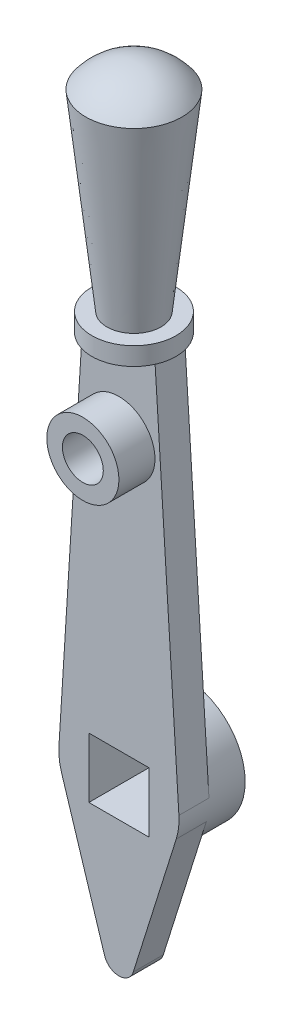
ISO-10303-21;
HEADER;
FILE_DESCRIPTION(('STEP AP214'),'2;1');
FILE_NAME('part.step','',(''),(''),'','','');
FILE_SCHEMA(('AUTOMOTIVE_DESIGN { 1 0 10303 214 1 1 1 1 }'));
ENDSEC;
DATA;
#1=APPLICATION_CONTEXT('core data for automotive mechanical design processes');
#2=APPLICATION_PROTOCOL_DEFINITION('international standard','automotive_design',2000,#1);
#3=PRODUCT_CONTEXT('',#1,'mechanical');
#4=PRODUCT('Part','Part','',(#3));
#5=PRODUCT_RELATED_PRODUCT_CATEGORY('part','',(#4));
#6=PRODUCT_DEFINITION_FORMATION('','',#4);
#7=PRODUCT_DEFINITION_CONTEXT('part definition',#1,'design');
#8=PRODUCT_DEFINITION('design','',#6,#7);
#9=PRODUCT_DEFINITION_SHAPE('','',#8);
#10=(LENGTH_UNIT() NAMED_UNIT(*) SI_UNIT(.MILLI.,.METRE.));
#11=(NAMED_UNIT(*) PLANE_ANGLE_UNIT() SI_UNIT($,.RADIAN.));
#12=(NAMED_UNIT(*) SI_UNIT($,.STERADIAN.) SOLID_ANGLE_UNIT());
#13=UNCERTAINTY_MEASURE_WITH_UNIT(LENGTH_MEASURE(1.E-05),#10,'distance_accuracy_value','');
#14=(GEOMETRIC_REPRESENTATION_CONTEXT(3) GLOBAL_UNCERTAINTY_ASSIGNED_CONTEXT((#13)) GLOBAL_UNIT_ASSIGNED_CONTEXT((#10,
#11,#12)) REPRESENTATION_CONTEXT('',''));
#15=CARTESIAN_POINT('',(0.,0.,0.));
#16=DIRECTION('',(0.,0.,1.));
#17=DIRECTION('',(1.,0.,0.));
#18=AXIS2_PLACEMENT_3D('',#15,#16,#17);
#19=CARTESIAN_POINT('',(0.,0.,-2.5));
#20=DIRECTION('',(0.,0.,1.));
#21=DIRECTION('',(1.,0.,0.));
#22=AXIS2_PLACEMENT_3D('',#19,#20,#21);
#23=PLANE('',#22);
#24=CARTESIAN_POINT('',(0.,50.,-2.5));
#25=DIRECTION('',(0.,0.,1.));
#26=DIRECTION('',(1.,0.,0.));
#27=AXIS2_PLACEMENT_3D('',#24,#25,#26);
#28=CIRCLE('',#27,3.39999999999999);
#29=CARTESIAN_POINT('',(3.39999999999999,50.,-2.5));
#30=VERTEX_POINT('',#29);
#31=EDGE_CURVE('E232',#30,#30,#28,.T.);
#32=ORIENTED_EDGE('',*,*,#31,.T.);
#33=EDGE_LOOP('',(#32));
#34=FACE_BOUND('',#33,.T.);
#35=DIRECTION('',(-0.0626843686366648,0.998033401208909,0.));
#36=VECTOR('',#35,1.);
#37=CARTESIAN_POINT('',(6.,64.,-2.5));
#38=LINE('',#37,#36);
#39=CARTESIAN_POINT('',(9.98033401208909,0.626843686366649,-2.5));
#40=VERTEX_POINT('',#39);
#41=CARTESIAN_POINT('',(6.,64.,-2.5));
#42=VERTEX_POINT('',#41);
#43=EDGE_CURVE('E140',#40,#42,#38,.T.);
#44=ORIENTED_EDGE('',*,*,#43,.F.);
#45=CARTESIAN_POINT('',(0.,0.,-2.5));
#46=DIRECTION('',(0.,0.,1.));
#47=DIRECTION('',(1.,0.,0.));
#48=AXIS2_PLACEMENT_3D('',#45,#46,#47);
#49=CIRCLE('',#48,10.);
#50=CARTESIAN_POINT('',(-9.98033401208909,0.626843686366649,-2.5));
#51=VERTEX_POINT('',#50);
#52=EDGE_CURVE('E11',#40,#51,#49,.T.);
#53=ORIENTED_EDGE('',*,*,#52,.T.);
#54=DIRECTION('',(-0.0626843686366648,-0.998033401208909,0.));
#55=VECTOR('',#54,1.);
#56=CARTESIAN_POINT('',(-6.,64.,-2.5));
#57=LINE('',#56,#55);
#58=CARTESIAN_POINT('',(-6.,64.,-2.5));
#59=VERTEX_POINT('',#58);
#60=EDGE_CURVE('E143',#59,#51,#57,.T.);
#61=ORIENTED_EDGE('',*,*,#60,.F.);
#62=DIRECTION('',(-1.,0.,0.));
#63=VECTOR('',#62,1.);
#64=CARTESIAN_POINT('',(6.,64.,-2.5));
#65=LINE('',#64,#63);
#66=EDGE_CURVE('E138',#42,#59,#65,.T.);
#67=ORIENTED_EDGE('',*,*,#66,.F.);
#68=EDGE_LOOP('',(#44,#53,#61,#67));
#69=FACE_BOUND('',#68,.T.);
#70=ADVANCED_FACE('F47',(#34,#69),#23,.F.);
#71=CARTESIAN_POINT('',(6.,64.,2.5));
#72=DIRECTION('',(-0.998033401208909,-0.0626843686366648,0.));
#73=DIRECTION('',(0.0626843686366648,-0.998033401208909,0.));
#74=AXIS2_PLACEMENT_3D('',#71,#72,#73);
#75=PLANE('',#74);
#76=ORIENTED_EDGE('',*,*,#43,.T.);
#77=DIRECTION('',(0.,0.,-1.));
#78=VECTOR('',#77,1.);
#79=CARTESIAN_POINT('',(6.,64.,2.5));
#80=LINE('',#79,#78);
#81=CARTESIAN_POINT('',(6.,64.,2.5));
#82=VERTEX_POINT('',#81);
#83=EDGE_CURVE('E151',#82,#42,#80,.T.);
#84=ORIENTED_EDGE('',*,*,#83,.F.);
#85=DIRECTION('',(-0.0626843686366648,0.998033401208909,0.));
#86=VECTOR('',#85,1.);
#87=CARTESIAN_POINT('',(6.,64.,2.5));
#88=LINE('',#87,#86);
#89=CARTESIAN_POINT('',(9.98033401208909,0.626843686366649,2.5));
#90=VERTEX_POINT('',#89);
#91=EDGE_CURVE('E219',#90,#82,#88,.T.);
#92=ORIENTED_EDGE('',*,*,#91,.F.);
#93=DIRECTION('',(0.,0.,-1.));
#94=VECTOR('',#93,1.);
#95=CARTESIAN_POINT('',(9.98033401208909,0.626843686366649,2.5));
#96=LINE('',#95,#94);
#97=EDGE_CURVE('E154',#90,#40,#96,.T.);
#98=ORIENTED_EDGE('',*,*,#97,.T.);
#99=EDGE_LOOP('',(#76,#84,#92,#98));
#100=FACE_BOUND('',#99,.T.);
#101=ADVANCED_FACE('F49',(#100),#75,.F.);
#102=CARTESIAN_POINT('',(-6.,64.,2.5));
#103=DIRECTION('',(0.998033401208909,-0.0626843686366648,0.));
#104=DIRECTION('',(0.0626843686366648,0.998033401208909,0.));
#105=AXIS2_PLACEMENT_3D('',#102,#103,#104);
#106=PLANE('',#105);
#107=ORIENTED_EDGE('',*,*,#60,.T.);
#108=DIRECTION('',(0.,0.,-1.));
#109=VECTOR('',#108,1.);
#110=CARTESIAN_POINT('',(-9.98033401208909,0.626843686366649,2.5));
#111=LINE('',#110,#109);
#112=CARTESIAN_POINT('',(-9.98033401208909,0.626843686366649,2.5));
#113=VERTEX_POINT('',#112);
#114=EDGE_CURVE('E167',#113,#51,#111,.T.);
#115=ORIENTED_EDGE('',*,*,#114,.F.);
#116=DIRECTION('',(-0.0626843686366648,-0.998033401208909,0.));
#117=VECTOR('',#116,1.);
#118=CARTESIAN_POINT('',(-6.,64.,2.5));
#119=LINE('',#118,#117);
#120=CARTESIAN_POINT('',(-6.,64.,2.5));
#121=VERTEX_POINT('',#120);
#122=EDGE_CURVE('E214',#121,#113,#119,.T.);
#123=ORIENTED_EDGE('',*,*,#122,.F.);
#124=DIRECTION('',(0.,0.,-1.));
#125=VECTOR('',#124,1.);
#126=CARTESIAN_POINT('',(-6.,64.,2.5));
#127=LINE('',#126,#125);
#128=EDGE_CURVE('E161',#121,#59,#127,.T.);
#129=ORIENTED_EDGE('',*,*,#128,.T.);
#130=EDGE_LOOP('',(#107,#115,#123,#129));
#131=FACE_BOUND('',#130,.T.);
#132=ADVANCED_FACE('F316',(#131),#106,.F.);
#133=CARTESIAN_POINT('',(0.,0.,2.5));
#134=DIRECTION('',(0.,0.,-1.));
#135=DIRECTION('',(-1.,0.,0.));
#136=AXIS2_PLACEMENT_3D('',#133,#134,#135);
#137=CYLINDRICAL_SURFACE('',#136,10.);
#138=ORIENTED_EDGE('',*,*,#114,.T.);
#139=ORIENTED_EDGE('',*,*,#52,.F.);
#140=ORIENTED_EDGE('',*,*,#97,.F.);
#141=CARTESIAN_POINT('',(0.,0.,2.5));
#142=DIRECTION('',(0.,0.,1.));
#143=DIRECTION('',(1.,0.,0.));
#144=AXIS2_PLACEMENT_3D('',#141,#142,#143);
#145=CIRCLE('',#144,10.);
#146=CARTESIAN_POINT('',(9.53939201416945,-3.,2.5));
#147=VERTEX_POINT('',#146);
#148=EDGE_CURVE('E194',#147,#90,#145,.T.);
#149=ORIENTED_EDGE('',*,*,#148,.F.);
#150=DIRECTION('',(0.,0.,-1.));
#151=VECTOR('',#150,1.);
#152=CARTESIAN_POINT('',(9.53939201416945,-3.,2.5));
#153=LINE('',#152,#151);
#154=CARTESIAN_POINT('',(9.53939201416946,-3.,-2.5));
#155=VERTEX_POINT('',#154);
#156=EDGE_CURVE('E185',#147,#155,#153,.T.);
#157=ORIENTED_EDGE('',*,*,#156,.T.);
#158=CARTESIAN_POINT('',(-9.53939201416946,-3.,-2.5));
#159=VERTEX_POINT('',#158);
#160=EDGE_CURVE('E51',#159,#155,#49,.T.);
#161=ORIENTED_EDGE('',*,*,#160,.F.);
#162=DIRECTION('',(0.,0.,-1.));
#163=VECTOR('',#162,1.);
#164=CARTESIAN_POINT('',(-9.53939201416946,-3.,2.5));
#165=LINE('',#164,#163);
#166=CARTESIAN_POINT('',(-9.53939201416946,-3.,2.5));
#167=VERTEX_POINT('',#166);
#168=EDGE_CURVE('E173',#167,#159,#165,.T.);
#169=ORIENTED_EDGE('',*,*,#168,.F.);
#170=CARTESIAN_POINT('',(0.,0.,2.5));
#171=DIRECTION('',(0.,0.,1.));
#172=DIRECTION('',(1.,0.,0.));
#173=AXIS2_PLACEMENT_3D('',#170,#171,#172);
#174=CIRCLE('',#173,10.);
#175=EDGE_CURVE('E211',#113,#167,#174,.T.);
#176=ORIENTED_EDGE('',*,*,#175,.F.);
#177=EDGE_LOOP('',(#138,#139,#140,#149,#157,#161,#169,#176));
#178=FACE_BOUND('',#177,.T.);
#179=CARTESIAN_POINT('',(0.,0.,-8.5));
#180=DIRECTION('',(0.,0.,1.));
#181=DIRECTION('',(1.,0.,0.));
#182=AXIS2_PLACEMENT_3D('',#179,#180,#181);
#183=CIRCLE('',#182,10.);
#184=CARTESIAN_POINT('',(10.,0.,-8.5));
#185=VERTEX_POINT('',#184);
#186=EDGE_CURVE('E156',#185,#185,#183,.T.);
#187=ORIENTED_EDGE('',*,*,#186,.T.);
#188=EDGE_LOOP('',(#187));
#189=FACE_BOUND('',#188,.T.);
#190=ADVANCED_FACE('F353',(#178,#189),#137,.T.);
#191=CARTESIAN_POINT('',(-9.53939201416945,-3.,2.5));
#192=DIRECTION('',(0.953939201416946,0.3,0.));
#193=DIRECTION('',(-0.3,0.953939201416946,0.));
#194=AXIS2_PLACEMENT_3D('',#191,#192,#193);
#195=PLANE('',#194);
#196=DIRECTION('',(0.3,-0.953939201416946,0.));
#197=VECTOR('',#196,1.);
#198=CARTESIAN_POINT('',(-9.53939201416945,-3.,-2.5));
#199=LINE('',#198,#197);
#200=CARTESIAN_POINT('',(-2.38484800354236,-25.75,-2.5));
#201=VERTEX_POINT('',#200);
#202=EDGE_CURVE('E198',#159,#201,#199,.T.);
#203=ORIENTED_EDGE('',*,*,#202,.T.);
#204=DIRECTION('',(0.,0.,-1.));
#205=VECTOR('',#204,1.);
#206=CARTESIAN_POINT('',(-2.38484800354236,-25.75,2.5));
#207=LINE('',#206,#205);
#208=CARTESIAN_POINT('',(-2.38484800354236,-25.75,2.5));
#209=VERTEX_POINT('',#208);
#210=EDGE_CURVE('E177',#209,#201,#207,.T.);
#211=ORIENTED_EDGE('',*,*,#210,.F.);
#212=DIRECTION('',(0.3,-0.953939201416946,0.));
#213=VECTOR('',#212,1.);
#214=CARTESIAN_POINT('',(-9.53939201416945,-3.,2.5));
#215=LINE('',#214,#213);
#216=EDGE_CURVE('E208',#167,#209,#215,.T.);
#217=ORIENTED_EDGE('',*,*,#216,.F.);
#218=ORIENTED_EDGE('',*,*,#168,.T.);
#219=EDGE_LOOP('',(#203,#211,#217,#218));
#220=FACE_BOUND('',#219,.T.);
#221=ADVANCED_FACE('F339',(#220),#195,.F.);
#222=CARTESIAN_POINT('',(0.,-25.,2.5));
#223=DIRECTION('',(0.,0.,-1.));
#224=DIRECTION('',(-1.,0.,0.));
#225=AXIS2_PLACEMENT_3D('',#222,#223,#224);
#226=CYLINDRICAL_SURFACE('',#225,2.5);
#227=CARTESIAN_POINT('',(0.,-25.,-2.5));
#228=DIRECTION('',(0.,0.,1.));
#229=DIRECTION('',(1.,0.,0.));
#230=AXIS2_PLACEMENT_3D('',#227,#228,#229);
#231=CIRCLE('',#230,2.5);
#232=CARTESIAN_POINT('',(2.38484800354236,-25.75,-2.5));
#233=VERTEX_POINT('',#232);
#234=EDGE_CURVE('E195',#201,#233,#231,.T.);
#235=ORIENTED_EDGE('',*,*,#234,.T.);
#236=DIRECTION('',(0.,0.,-1.));
#237=VECTOR('',#236,1.);
#238=CARTESIAN_POINT('',(2.38484800354236,-25.75,2.5));
#239=LINE('',#238,#237);
#240=CARTESIAN_POINT('',(2.38484800354236,-25.75,2.5));
#241=VERTEX_POINT('',#240);
#242=EDGE_CURVE('E181',#241,#233,#239,.T.);
#243=ORIENTED_EDGE('',*,*,#242,.F.);
#244=CARTESIAN_POINT('',(0.,-25.,2.5));
#245=DIRECTION('',(0.,0.,1.));
#246=DIRECTION('',(1.,0.,0.));
#247=AXIS2_PLACEMENT_3D('',#244,#245,#246);
#248=CIRCLE('',#247,2.5);
#249=EDGE_CURVE('E205',#209,#241,#248,.T.);
#250=ORIENTED_EDGE('',*,*,#249,.F.);
#251=ORIENTED_EDGE('',*,*,#210,.T.);
#252=EDGE_LOOP('',(#235,#243,#250,#251));
#253=FACE_BOUND('',#252,.T.);
#254=ADVANCED_FACE('F344',(#253),#226,.T.);
#255=CARTESIAN_POINT('',(9.53939201416945,-3.,2.5));
#256=DIRECTION('',(-0.953939201416946,0.3,0.));
#257=DIRECTION('',(-0.3,-0.953939201416946,0.));
#258=AXIS2_PLACEMENT_3D('',#255,#256,#257);
#259=PLANE('',#258);
#260=DIRECTION('',(0.3,0.953939201416946,0.));
#261=VECTOR('',#260,1.);
#262=CARTESIAN_POINT('',(9.53939201416945,-3.,-2.5));
#263=LINE('',#262,#261);
#264=EDGE_CURVE('E190',#233,#155,#263,.T.);
#265=ORIENTED_EDGE('',*,*,#264,.T.);
#266=ORIENTED_EDGE('',*,*,#156,.F.);
#267=DIRECTION('',(0.3,0.953939201416946,0.));
#268=VECTOR('',#267,1.);
#269=CARTESIAN_POINT('',(9.53939201416945,-3.,2.5));
#270=LINE('',#269,#268);
#271=EDGE_CURVE('E189',#241,#147,#270,.T.);
#272=ORIENTED_EDGE('',*,*,#271,.F.);
#273=ORIENTED_EDGE('',*,*,#242,.T.);
#274=EDGE_LOOP('',(#265,#266,#272,#273));
#275=FACE_BOUND('',#274,.T.);
#276=ADVANCED_FACE('F332',(#275),#259,.F.);
#277=CARTESIAN_POINT('',(0.,0.,2.5));
#278=DIRECTION('',(0.,0.,1.));
#279=DIRECTION('',(1.,0.,0.));
#280=AXIS2_PLACEMENT_3D('',#277,#278,#279);
#281=PLANE('',#280);
#282=DIRECTION('',(0.,1.,0.));
#283=VECTOR('',#282,1.);
#284=CARTESIAN_POINT('',(5.,0.,2.5));
#285=LINE('',#284,#283);
#286=CARTESIAN_POINT('',(5.,-5.,2.5));
#287=VERTEX_POINT('',#286);
#288=CARTESIAN_POINT('',(5.,5.,2.5));
#289=VERTEX_POINT('',#288);
#290=EDGE_CURVE('E243',#287,#289,#285,.T.);
#291=ORIENTED_EDGE('',*,*,#290,.F.);
#292=DIRECTION('',(1.,0.,0.));
#293=VECTOR('',#292,1.);
#294=CARTESIAN_POINT('',(0.,-5.,2.5));
#295=LINE('',#294,#293);
#296=CARTESIAN_POINT('',(-5.,-5.,2.5));
#297=VERTEX_POINT('',#296);
#298=EDGE_CURVE('E252',#297,#287,#295,.T.);
#299=ORIENTED_EDGE('',*,*,#298,.F.);
#300=DIRECTION('',(0.,-1.,0.));
#301=VECTOR('',#300,1.);
#302=CARTESIAN_POINT('',(-5.,0.,2.5));
#303=LINE('',#302,#301);
#304=CARTESIAN_POINT('',(-5.,5.,2.5));
#305=VERTEX_POINT('',#304);
#306=EDGE_CURVE('E249',#305,#297,#303,.T.);
#307=ORIENTED_EDGE('',*,*,#306,.F.);
#308=DIRECTION('',(-1.,0.,0.));
#309=VECTOR('',#308,1.);
#310=CARTESIAN_POINT('',(0.,5.,2.5));
#311=LINE('',#310,#309);
#312=EDGE_CURVE('E246',#289,#305,#311,.T.);
#313=ORIENTED_EDGE('',*,*,#312,.F.);
#314=EDGE_LOOP('',(#291,#299,#307,#313));
#315=FACE_BOUND('',#314,.T.);
#316=CARTESIAN_POINT('',(0.,50.,2.5));
#317=DIRECTION('',(0.,0.,1.));
#318=DIRECTION('',(1.,0.,0.));
#319=AXIS2_PLACEMENT_3D('',#316,#317,#318);
#320=CIRCLE('',#319,6.);
#321=CARTESIAN_POINT('',(6.,50.,2.5));
#322=VERTEX_POINT('',#321);
#323=EDGE_CURVE('E228',#322,#322,#320,.T.);
#324=ORIENTED_EDGE('',*,*,#323,.F.);
#325=EDGE_LOOP('',(#324));
#326=FACE_BOUND('',#325,.T.);
#327=ORIENTED_EDGE('',*,*,#271,.T.);
#328=ORIENTED_EDGE('',*,*,#148,.T.);
#329=ORIENTED_EDGE('',*,*,#91,.T.);
#330=DIRECTION('',(-1.,0.,0.));
#331=VECTOR('',#330,1.);
#332=CARTESIAN_POINT('',(6.,64.,2.5));
#333=LINE('',#332,#331);
#334=EDGE_CURVE('E159',#82,#121,#333,.T.);
#335=ORIENTED_EDGE('',*,*,#334,.T.);
#336=ORIENTED_EDGE('',*,*,#122,.T.);
#337=ORIENTED_EDGE('',*,*,#175,.T.);
#338=ORIENTED_EDGE('',*,*,#216,.T.);
#339=ORIENTED_EDGE('',*,*,#249,.T.);
#340=EDGE_LOOP('',(#327,#328,#329,#335,#336,#337,#338,#339));
#341=FACE_BOUND('',#340,.T.);
#342=ADVANCED_FACE('F321',(#315,#326,#341),#281,.T.);
#343=ORIENTED_EDGE('',*,*,#202,.F.);
#344=ORIENTED_EDGE('',*,*,#160,.T.);
#345=ORIENTED_EDGE('',*,*,#264,.F.);
#346=ORIENTED_EDGE('',*,*,#234,.F.);
#347=EDGE_LOOP('',(#343,#344,#345,#346));
#348=FACE_BOUND('',#347,.T.);
#349=ADVANCED_FACE('F311',(#348),#23,.F.);
#350=CARTESIAN_POINT('',(0.,0.,-8.5));
#351=DIRECTION('',(0.,0.,1.));
#352=DIRECTION('',(1.,0.,0.));
#353=AXIS2_PLACEMENT_3D('',#350,#351,#352);
#354=PLANE('',#353);
#355=DIRECTION('',(-1.,0.,0.));
#356=VECTOR('',#355,1.);
#357=CARTESIAN_POINT('',(-5.,-5.,-8.5));
#358=LINE('',#357,#356);
#359=CARTESIAN_POINT('',(5.,-5.,-8.5));
#360=VERTEX_POINT('',#359);
#361=CARTESIAN_POINT('',(-5.,-5.,-8.5));
#362=VERTEX_POINT('',#361);
#363=EDGE_CURVE('E274',#360,#362,#358,.T.);
#364=ORIENTED_EDGE('',*,*,#363,.F.);
#365=DIRECTION('',(0.,-1.,0.));
#366=VECTOR('',#365,1.);
#367=CARTESIAN_POINT('',(5.,5.,-8.5));
#368=LINE('',#367,#366);
#369=CARTESIAN_POINT('',(5.,5.,-8.5));
#370=VERTEX_POINT('',#369);
#371=EDGE_CURVE('E71',#370,#360,#368,.T.);
#372=ORIENTED_EDGE('',*,*,#371,.F.);
#373=DIRECTION('',(1.,0.,0.));
#374=VECTOR('',#373,1.);
#375=CARTESIAN_POINT('',(-5.,5.,-8.5));
#376=LINE('',#375,#374);
#377=CARTESIAN_POINT('',(-5.,5.,-8.5));
#378=VERTEX_POINT('',#377);
#379=EDGE_CURVE('E259',#378,#370,#376,.T.);
#380=ORIENTED_EDGE('',*,*,#379,.F.);
#381=DIRECTION('',(0.,1.,0.));
#382=VECTOR('',#381,1.);
#383=CARTESIAN_POINT('',(-5.,5.,-8.5));
#384=LINE('',#383,#382);
#385=EDGE_CURVE('E270',#362,#378,#384,.T.);
#386=ORIENTED_EDGE('',*,*,#385,.F.);
#387=EDGE_LOOP('',(#364,#372,#380,#386));
#388=FACE_BOUND('',#387,.T.);
#389=ORIENTED_EDGE('',*,*,#186,.F.);
#390=EDGE_LOOP('',(#389));
#391=FACE_BOUND('',#390,.T.);
#392=ADVANCED_FACE('F320',(#388,#391),#354,.F.);
#393=CARTESIAN_POINT('',(0.,50.,8.5));
#394=DIRECTION('',(0.,0.,-1.));
#395=DIRECTION('',(-1.,0.,0.));
#396=AXIS2_PLACEMENT_3D('',#393,#394,#395);
#397=CYLINDRICAL_SURFACE('',#396,6.);
#398=CARTESIAN_POINT('',(0.,50.,8.5));
#399=DIRECTION('',(0.,0.,1.));
#400=DIRECTION('',(1.,0.,0.));
#401=AXIS2_PLACEMENT_3D('',#398,#399,#400);
#402=CIRCLE('',#401,6.);
#403=CARTESIAN_POINT('',(6.,50.,8.5));
#404=VERTEX_POINT('',#403);
#405=EDGE_CURVE('E227',#404,#404,#402,.T.);
#406=ORIENTED_EDGE('',*,*,#405,.F.);
#407=EDGE_LOOP('',(#406));
#408=FACE_BOUND('',#407,.T.);
#409=ORIENTED_EDGE('',*,*,#323,.T.);
#410=EDGE_LOOP('',(#409));
#411=FACE_BOUND('',#410,.T.);
#412=ADVANCED_FACE('F328',(#408,#411),#397,.T.);
#413=CARTESIAN_POINT('',(0.,50.,8.5));
#414=DIRECTION('',(0.,0.,1.));
#415=DIRECTION('',(1.,0.,0.));
#416=AXIS2_PLACEMENT_3D('',#413,#414,#415);
#417=PLANE('',#416);
#418=CARTESIAN_POINT('',(0.,50.,8.5));
#419=DIRECTION('',(0.,0.,1.));
#420=DIRECTION('',(1.,0.,0.));
#421=AXIS2_PLACEMENT_3D('',#418,#419,#420);
#422=CIRCLE('',#421,3.39999999999999);
#423=CARTESIAN_POINT('',(3.39999999999999,50.,8.5));
#424=VERTEX_POINT('',#423);
#425=EDGE_CURVE('E239',#424,#424,#422,.T.);
#426=ORIENTED_EDGE('',*,*,#425,.F.);
#427=EDGE_LOOP('',(#426));
#428=FACE_BOUND('',#427,.T.);
#429=ORIENTED_EDGE('',*,*,#405,.T.);
#430=EDGE_LOOP('',(#429));
#431=FACE_BOUND('',#430,.T.);
#432=ADVANCED_FACE('F497',(#428,#431),#417,.T.);
#433=CARTESIAN_POINT('',(0.,50.,8.5));
#434=DIRECTION('',(0.,0.,1.));
#435=DIRECTION('',(1.,0.,0.));
#436=AXIS2_PLACEMENT_3D('',#433,#434,#435);
#437=CYLINDRICAL_SURFACE('',#436,3.39999999999999);
#438=ORIENTED_EDGE('',*,*,#425,.T.);
#439=EDGE_LOOP('',(#438));
#440=FACE_BOUND('',#439,.T.);
#441=ORIENTED_EDGE('',*,*,#31,.F.);
#442=EDGE_LOOP('',(#441));
#443=FACE_BOUND('',#442,.T.);
#444=ADVANCED_FACE('F489',(#440,#443),#437,.F.);
#445=CARTESIAN_POINT('',(5.,5.,8.5));
#446=DIRECTION('',(1.,0.,0.));
#447=DIRECTION('',(0.,1.,0.));
#448=AXIS2_PLACEMENT_3D('',#445,#446,#447);
#449=PLANE('',#448);
#450=ORIENTED_EDGE('',*,*,#290,.T.);
#451=DIRECTION('',(0.,0.,-1.));
#452=VECTOR('',#451,1.);
#453=CARTESIAN_POINT('',(5.,5.,8.5));
#454=LINE('',#453,#452);
#455=EDGE_CURVE('E255',#289,#370,#454,.T.);
#456=ORIENTED_EDGE('',*,*,#455,.T.);
#457=ORIENTED_EDGE('',*,*,#371,.T.);
#458=DIRECTION('',(0.,0.,-1.));
#459=VECTOR('',#458,1.);
#460=CARTESIAN_POINT('',(5.,-5.,8.5));
#461=LINE('',#460,#459);
#462=EDGE_CURVE('E256',#287,#360,#461,.T.);
#463=ORIENTED_EDGE('',*,*,#462,.F.);
#464=EDGE_LOOP('',(#450,#456,#457,#463));
#465=FACE_BOUND('',#464,.T.);
#466=ADVANCED_FACE('F480',(#465),#449,.F.);
#467=CARTESIAN_POINT('',(-5.,5.,8.5));
#468=DIRECTION('',(0.,1.,0.));
#469=DIRECTION('',(-1.,0.,0.));
#470=AXIS2_PLACEMENT_3D('',#467,#468,#469);
#471=PLANE('',#470);
#472=ORIENTED_EDGE('',*,*,#312,.T.);
#473=DIRECTION('',(0.,0.,-1.));
#474=VECTOR('',#473,1.);
#475=CARTESIAN_POINT('',(-5.,5.,8.5));
#476=LINE('',#475,#474);
#477=EDGE_CURVE('E262',#305,#378,#476,.T.);
#478=ORIENTED_EDGE('',*,*,#477,.T.);
#479=ORIENTED_EDGE('',*,*,#379,.T.);
#480=ORIENTED_EDGE('',*,*,#455,.F.);
#481=EDGE_LOOP('',(#472,#478,#479,#480));
#482=FACE_BOUND('',#481,.T.);
#483=ADVANCED_FACE('F471',(#482),#471,.F.);
#484=CARTESIAN_POINT('',(-5.,5.,8.5));
#485=DIRECTION('',(-1.,0.,0.));
#486=DIRECTION('',(0.,-1.,0.));
#487=AXIS2_PLACEMENT_3D('',#484,#485,#486);
#488=PLANE('',#487);
#489=ORIENTED_EDGE('',*,*,#306,.T.);
#490=DIRECTION('',(0.,0.,-1.));
#491=VECTOR('',#490,1.);
#492=CARTESIAN_POINT('',(-5.,-5.,8.5));
#493=LINE('',#492,#491);
#494=EDGE_CURVE('E63',#297,#362,#493,.T.);
#495=ORIENTED_EDGE('',*,*,#494,.T.);
#496=ORIENTED_EDGE('',*,*,#385,.T.);
#497=ORIENTED_EDGE('',*,*,#477,.F.);
#498=EDGE_LOOP('',(#489,#495,#496,#497));
#499=FACE_BOUND('',#498,.T.);
#500=ADVANCED_FACE('F463',(#499),#488,.F.);
#501=CARTESIAN_POINT('',(-5.,-5.,8.5));
#502=DIRECTION('',(0.,-1.,0.));
#503=DIRECTION('',(0.,0.,-1.));
#504=AXIS2_PLACEMENT_3D('',#501,#502,#503);
#505=PLANE('',#504);
#506=ORIENTED_EDGE('',*,*,#298,.T.);
#507=ORIENTED_EDGE('',*,*,#462,.T.);
#508=ORIENTED_EDGE('',*,*,#363,.T.);
#509=ORIENTED_EDGE('',*,*,#494,.F.);
#510=EDGE_LOOP('',(#506,#507,#508,#509));
#511=FACE_BOUND('',#510,.T.);
#512=ADVANCED_FACE('F425',(#511),#505,.F.);
#513=CARTESIAN_POINT('',(0.,64.,0.));
#514=DIRECTION('',(0.,1.,0.));
#515=DIRECTION('',(0.,0.,1.));
#516=AXIS2_PLACEMENT_3D('',#513,#514,#515);
#517=PLANE('',#516);
#518=CARTESIAN_POINT('',(0.,64.,0.));
#519=DIRECTION('',(0.,-1.,0.));
#520=DIRECTION('',(0.,0.,-1.));
#521=AXIS2_PLACEMENT_3D('',#518,#519,#520);
#522=CIRCLE('',#521,7.);
#523=CARTESIAN_POINT('',(0.,64.,-7.));
#524=VERTEX_POINT('',#523);
#525=EDGE_CURVE('E279',#524,#524,#522,.T.);
#526=ORIENTED_EDGE('',*,*,#525,.T.);
#527=EDGE_LOOP('',(#526));
#528=FACE_BOUND('',#527,.T.);
#529=ORIENTED_EDGE('',*,*,#83,.T.);
#530=ORIENTED_EDGE('',*,*,#66,.T.);
#531=ORIENTED_EDGE('',*,*,#128,.F.);
#532=ORIENTED_EDGE('',*,*,#334,.F.);
#533=EDGE_LOOP('',(#529,#530,#531,#532));
#534=FACE_BOUND('',#533,.T.);
#535=ADVANCED_FACE('F158',(#528,#534),#517,.F.);
#536=CARTESIAN_POINT('',(0.,0.,0.));
#537=DIRECTION('',(0.,-1.,0.));
#538=DIRECTION('',(0.,0.,-1.));
#539=AXIS2_PLACEMENT_3D('',#536,#537,#538);
#540=CYLINDRICAL_SURFACE('',#539,7.);
#541=ORIENTED_EDGE('',*,*,#525,.F.);
#542=EDGE_LOOP('',(#541));
#543=FACE_BOUND('',#542,.T.);
#544=CARTESIAN_POINT('',(0.,67.,0.));
#545=DIRECTION('',(0.,-1.,0.));
#546=DIRECTION('',(0.,0.,-1.));
#547=AXIS2_PLACEMENT_3D('',#544,#545,#546);
#548=CIRCLE('',#547,7.);
#549=CARTESIAN_POINT('',(0.,67.,-7.));
#550=VERTEX_POINT('',#549);
#551=EDGE_CURVE('E283',#550,#550,#548,.T.);
#552=ORIENTED_EDGE('',*,*,#551,.T.);
#553=EDGE_LOOP('',(#552));
#554=FACE_BOUND('',#553,.T.);
#555=ADVANCED_FACE('F424',(#543,#554),#540,.T.);
#556=CARTESIAN_POINT('',(-7.,67.,0.));
#557=DIRECTION('',(0.,-1.,0.));
#558=DIRECTION('',(0.,0.,-1.));
#559=AXIS2_PLACEMENT_3D('',#556,#557,#558);
#560=PLANE('',#559);
#561=ORIENTED_EDGE('',*,*,#551,.F.);
#562=EDGE_LOOP('',(#561));
#563=FACE_BOUND('',#562,.T.);
#564=CARTESIAN_POINT('',(0.,67.,0.));
#565=DIRECTION('',(0.,-1.,0.));
#566=DIRECTION('',(0.,0.,-1.));
#567=AXIS2_PLACEMENT_3D('',#564,#565,#566);
#568=CIRCLE('',#567,4.5);
#569=CARTESIAN_POINT('',(0.,67.,-4.5));
#570=VERTEX_POINT('',#569);
#571=EDGE_CURVE('E287',#570,#570,#568,.T.);
#572=ORIENTED_EDGE('',*,*,#571,.T.);
#573=EDGE_LOOP('',(#572));
#574=FACE_BOUND('',#573,.T.);
#575=ADVANCED_FACE('F305',(#563,#574),#560,.F.);
#576=CARTESIAN_POINT('',(0.,99.,0.));
#577=DIRECTION('',(0.,1.,0.));
#578=DIRECTION('',(0.,0.,1.));
#579=AXIS2_PLACEMENT_3D('',#576,#577,#578);
#580=CONICAL_SURFACE('',#579,8.,0.108941956989866);
#581=ORIENTED_EDGE('',*,*,#571,.F.);
#582=EDGE_LOOP('',(#581));
#583=FACE_BOUND('',#582,.T.);
#584=CARTESIAN_POINT('',(0.,99.,0.));
#585=DIRECTION('',(0.,-1.,0.));
#586=DIRECTION('',(0.,0.,-1.));
#587=AXIS2_PLACEMENT_3D('',#584,#585,#586);
#588=CIRCLE('',#587,8.);
#589=CARTESIAN_POINT('',(0.,99.,-8.));
#590=VERTEX_POINT('',#589);
#591=EDGE_CURVE('E291',#590,#590,#588,.T.);
#592=ORIENTED_EDGE('',*,*,#591,.T.);
#593=EDGE_LOOP('',(#592));
#594=FACE_BOUND('',#593,.T.);
#595=ADVANCED_FACE('F297',(#583,#594),#580,.T.);
#596=CARTESIAN_POINT('',(0.,93.,0.));
#597=DIRECTION('',(0.,-1.,0.));
#598=DIRECTION('',(-1.,0.,0.));
#599=AXIS2_PLACEMENT_3D('',#596,#597,#598);
#600=SPHERICAL_SURFACE('',#599,10.);
#601=ORIENTED_EDGE('',*,*,#591,.F.);
#602=EDGE_LOOP('',(#601));
#603=FACE_BOUND('',#602,.T.);
#604=ADVANCED_FACE('F299',(#603),#600,.T.);
#605=CLOSED_SHELL('',(#70,#101,#132,#190,#221,#254,#276,#342,#349,#392,#412,#432,#444,#466,#483,
#500,#512,#535,#555,#575,#595,#604));
#606=MANIFOLD_SOLID_BREP('B2',#605);
#607=ADVANCED_BREP_SHAPE_REPRESENTATION('',(#18,#606),#14);
#608=SHAPE_DEFINITION_REPRESENTATION(#9,#607);
ENDSEC;
END-ISO-10303-21;
